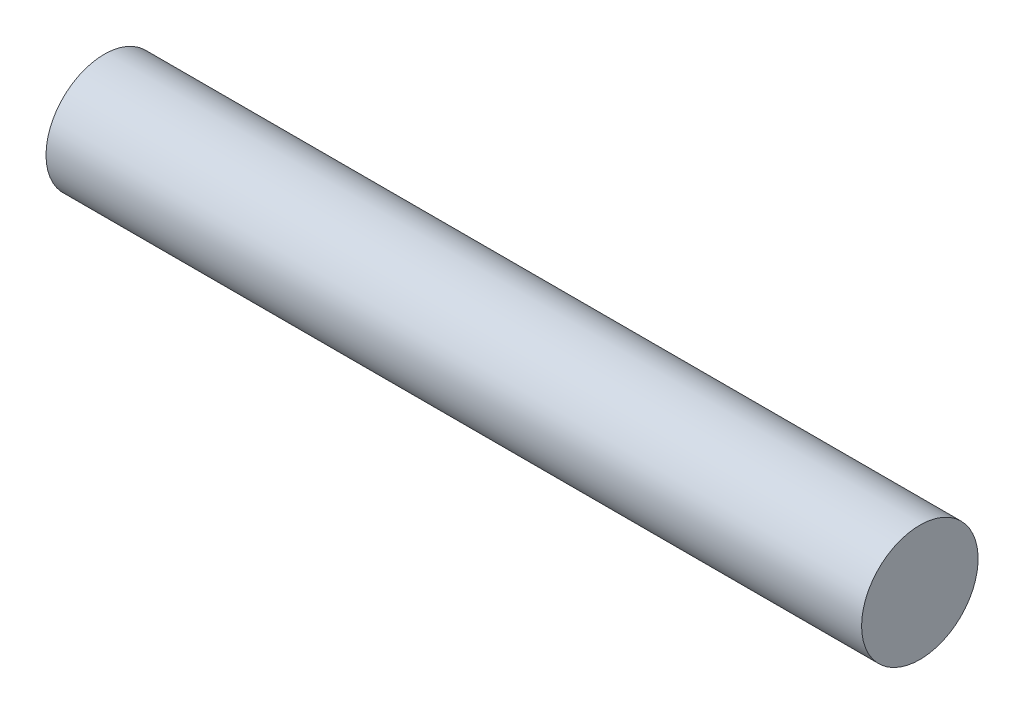
ISO-10303-21;
HEADER;
FILE_DESCRIPTION(('STEP AP214'),'2;1');
FILE_NAME('part.step','',(''),(''),'','','');
FILE_SCHEMA(('AUTOMOTIVE_DESIGN { 1 0 10303 214 1 1 1 1 }'));
ENDSEC;
DATA;
#1=APPLICATION_CONTEXT('core data for automotive mechanical design processes');
#2=APPLICATION_PROTOCOL_DEFINITION('international standard','automotive_design',2000,#1);
#3=PRODUCT_CONTEXT('',#1,'mechanical');
#4=PRODUCT('Part','Part','',(#3));
#5=PRODUCT_RELATED_PRODUCT_CATEGORY('part','',(#4));
#6=PRODUCT_DEFINITION_FORMATION('','',#4);
#7=PRODUCT_DEFINITION_CONTEXT('part definition',#1,'design');
#8=PRODUCT_DEFINITION('design','',#6,#7);
#9=PRODUCT_DEFINITION_SHAPE('','',#8);
#10=(LENGTH_UNIT() NAMED_UNIT(*) SI_UNIT(.MILLI.,.METRE.));
#11=(NAMED_UNIT(*) PLANE_ANGLE_UNIT() SI_UNIT($,.RADIAN.));
#12=(NAMED_UNIT(*) SI_UNIT($,.STERADIAN.) SOLID_ANGLE_UNIT());
#13=UNCERTAINTY_MEASURE_WITH_UNIT(LENGTH_MEASURE(1.E-05),#10,'distance_accuracy_value','');
#14=(GEOMETRIC_REPRESENTATION_CONTEXT(3) GLOBAL_UNCERTAINTY_ASSIGNED_CONTEXT((#13)) GLOBAL_UNIT_ASSIGNED_CONTEXT((#10,
#11,#12)) REPRESENTATION_CONTEXT('',''));
#15=CARTESIAN_POINT('',(0.,0.,0.));
#16=DIRECTION('',(0.,0.,1.));
#17=DIRECTION('',(1.,0.,0.));
#18=AXIS2_PLACEMENT_3D('',#15,#16,#17);
#19=CARTESIAN_POINT('',(7.,0.,0.));
#20=DIRECTION('',(-1.,0.,0.));
#21=DIRECTION('',(0.,0.,1.));
#22=AXIS2_PLACEMENT_3D('',#19,#20,#21);
#23=CYLINDRICAL_SURFACE('',#22,1.);
#24=CARTESIAN_POINT('',(7.,0.,0.));
#25=DIRECTION('',(1.,0.,0.));
#26=DIRECTION('',(0.,0.,-1.));
#27=AXIS2_PLACEMENT_3D('',#24,#25,#26);
#28=CIRCLE('',#27,1.);
#29=CARTESIAN_POINT('',(7.,0.,1.));
#30=VERTEX_POINT('',#29);
#31=EDGE_CURVE('E10',#30,#30,#28,.T.);
#32=CARTESIAN_POINT('',(-7.,0.,0.));
#33=DIRECTION('',(1.,0.,0.));
#34=DIRECTION('',(0.,0.,-1.));
#35=AXIS2_PLACEMENT_3D('',#32,#33,#34);
#36=CIRCLE('',#35,1.);
#37=CARTESIAN_POINT('',(-7.,0.,1.));
#38=VERTEX_POINT('',#37);
#39=EDGE_CURVE('E48',#38,#38,#36,.T.);
#40=CARTESIAN_POINT('',(7.,0.,1.));
#41=CARTESIAN_POINT('',(6.85416666666667,0.,1.));
#42=CARTESIAN_POINT('',(6.70833333333333,0.,1.));
#43=CARTESIAN_POINT('',(6.41666666666667,0.,1.));
#44=CARTESIAN_POINT('',(6.27083333333333,0.,1.));
#45=CARTESIAN_POINT('',(5.97916666666667,0.,1.));
#46=CARTESIAN_POINT('',(5.83333333333333,0.,1.));
#47=CARTESIAN_POINT('',(5.54166666666667,0.,1.));
#48=CARTESIAN_POINT('',(5.39583333333333,0.,1.));
#49=CARTESIAN_POINT('',(5.10416666666667,0.,1.));
#50=CARTESIAN_POINT('',(4.95833333333333,0.,1.));
#51=CARTESIAN_POINT('',(4.66666666666667,0.,1.));
#52=CARTESIAN_POINT('',(4.52083333333333,0.,1.));
#53=CARTESIAN_POINT('',(4.22916666666667,0.,1.));
#54=CARTESIAN_POINT('',(4.08333333333333,0.,1.));
#55=CARTESIAN_POINT('',(3.79166666666667,0.,1.));
#56=CARTESIAN_POINT('',(3.64583333333333,0.,1.));
#57=CARTESIAN_POINT('',(3.35416666666667,0.,1.));
#58=CARTESIAN_POINT('',(3.20833333333333,0.,1.));
#59=CARTESIAN_POINT('',(2.91666666666667,0.,1.));
#60=CARTESIAN_POINT('',(2.77083333333333,0.,1.));
#61=CARTESIAN_POINT('',(2.47916666666667,0.,1.));
#62=CARTESIAN_POINT('',(2.33333333333333,0.,1.));
#63=CARTESIAN_POINT('',(2.04166666666667,0.,1.));
#64=CARTESIAN_POINT('',(1.89583333333333,0.,1.));
#65=CARTESIAN_POINT('',(1.60416666666667,0.,1.));
#66=CARTESIAN_POINT('',(1.45833333333333,0.,1.));
#67=CARTESIAN_POINT('',(1.16666666666667,0.,1.));
#68=CARTESIAN_POINT('',(1.02083333333333,0.,1.));
#69=CARTESIAN_POINT('',(0.729166666666666,0.,1.));
#70=CARTESIAN_POINT('',(0.583333333333333,0.,1.));
#71=CARTESIAN_POINT('',(0.291666666666666,0.,1.));
#72=CARTESIAN_POINT('',(0.145833333333333,0.,1.));
#73=CARTESIAN_POINT('',(-0.145833333333334,0.,1.));
#74=CARTESIAN_POINT('',(-0.291666666666668,0.,1.));
#75=CARTESIAN_POINT('',(-0.583333333333334,0.,1.));
#76=CARTESIAN_POINT('',(-0.729166666666668,0.,1.));
#77=CARTESIAN_POINT('',(-1.02083333333333,0.,1.));
#78=CARTESIAN_POINT('',(-1.16666666666667,0.,1.));
#79=CARTESIAN_POINT('',(-1.45833333333333,0.,1.));
#80=CARTESIAN_POINT('',(-1.60416666666667,0.,1.));
#81=CARTESIAN_POINT('',(-1.89583333333333,0.,1.));
#82=CARTESIAN_POINT('',(-2.04166666666667,0.,1.));
#83=CARTESIAN_POINT('',(-2.33333333333333,0.,1.));
#84=CARTESIAN_POINT('',(-2.47916666666667,0.,1.));
#85=CARTESIAN_POINT('',(-2.77083333333333,0.,1.));
#86=CARTESIAN_POINT('',(-2.91666666666667,0.,1.));
#87=CARTESIAN_POINT('',(-3.20833333333333,0.,1.));
#88=CARTESIAN_POINT('',(-3.35416666666667,0.,1.));
#89=CARTESIAN_POINT('',(-3.64583333333333,0.,1.));
#90=CARTESIAN_POINT('',(-3.79166666666667,0.,1.));
#91=CARTESIAN_POINT('',(-4.08333333333333,0.,1.));
#92=CARTESIAN_POINT('',(-4.22916666666667,0.,1.));
#93=CARTESIAN_POINT('',(-4.52083333333333,0.,1.));
#94=CARTESIAN_POINT('',(-4.66666666666667,0.,1.));
#95=CARTESIAN_POINT('',(-4.95833333333333,0.,1.));
#96=CARTESIAN_POINT('',(-5.10416666666667,0.,1.));
#97=CARTESIAN_POINT('',(-5.39583333333333,0.,1.));
#98=CARTESIAN_POINT('',(-5.54166666666667,0.,1.));
#99=CARTESIAN_POINT('',(-5.83333333333333,0.,1.));
#100=CARTESIAN_POINT('',(-5.97916666666667,0.,1.));
#101=CARTESIAN_POINT('',(-6.27083333333333,0.,1.));
#102=CARTESIAN_POINT('',(-6.41666666666667,0.,1.));
#103=CARTESIAN_POINT('',(-6.70833333333333,0.,1.));
#104=CARTESIAN_POINT('',(-6.85416666666667,0.,1.));
#105=CARTESIAN_POINT('',(-7.,0.,1.));
#106=B_SPLINE_CURVE_WITH_KNOTS('',3,(#40,#41,#42,#43,#44,#45,#46,#47,#48,#49,#50,#51,#52,#53,
#54,#55,#56,#57,#58,#59,#60,#61,#62,#63,#64,#65,#66,#67,#68,#69,#70,#71,#72,#73,#74,#75,#76,#77,
#78,#79,#80,#81,#82,#83,#84,#85,#86,#87,#88,#89,#90,#91,#92,#93,#94,#95,#96,#97,#98,#99,#100,
#101,#102,#103,#104,#105),.UNSPECIFIED.,.F.,.F.,(4,2,2,2,2,2,2,2,2,2,2,2,2,2,2,2,2,2,2,2,2,2,2,
2,2,2,2,2,2,2,2,2,4),(0.,0.4375,0.875000000000001,1.3125,1.75,2.1875,2.625,3.0625,3.5,3.9375,
4.375,4.8125,5.25,5.6875,6.125,6.5625,7.,7.4375,7.875,8.3125,8.75,9.1875,9.625,10.0625,10.5,
10.9375,11.375,11.8125,12.25,12.6875,13.125,13.5625,14.),.UNSPECIFIED.);
#107=EDGE_CURVE('BSEAM45',#30,#38,#106,.T.);
#108=ORIENTED_EDGE('',*,*,#31,.F.);
#109=ORIENTED_EDGE('',*,*,#39,.T.);
#110=ORIENTED_EDGE('',*,*,#107,.T.);
#111=ORIENTED_EDGE('',*,*,#107,.F.);
#112=EDGE_LOOP('',(#108,#110,#109,#111));
#113=FACE_BOUND('',#112,.T.);
#114=ADVANCED_FACE('F45',(#113),#23,.T.);
#115=CARTESIAN_POINT('',(7.,0.,0.));
#116=DIRECTION('',(1.,0.,0.));
#117=DIRECTION('',(0.,0.,-1.));
#118=AXIS2_PLACEMENT_3D('',#115,#116,#117);
#119=PLANE('',#118);
#120=ORIENTED_EDGE('',*,*,#31,.T.);
#121=EDGE_LOOP('',(#120));
#122=FACE_BOUND('',#121,.T.);
#123=ADVANCED_FACE('F62',(#122),#119,.T.);
#124=CARTESIAN_POINT('',(-7.,0.,0.));
#125=DIRECTION('',(1.,0.,0.));
#126=DIRECTION('',(0.,0.,-1.));
#127=AXIS2_PLACEMENT_3D('',#124,#125,#126);
#128=PLANE('',#127);
#129=ORIENTED_EDGE('',*,*,#39,.F.);
#130=EDGE_LOOP('',(#129));
#131=FACE_BOUND('',#130,.T.);
#132=ADVANCED_FACE('F60',(#131),#128,.F.);
#133=CLOSED_SHELL('',(#114,#123,#132));
#134=MANIFOLD_SOLID_BREP('B2',#133);
#135=ADVANCED_BREP_SHAPE_REPRESENTATION('',(#18,#134),#14);
#136=SHAPE_DEFINITION_REPRESENTATION(#9,#135);
ENDSEC;
END-ISO-10303-21;
